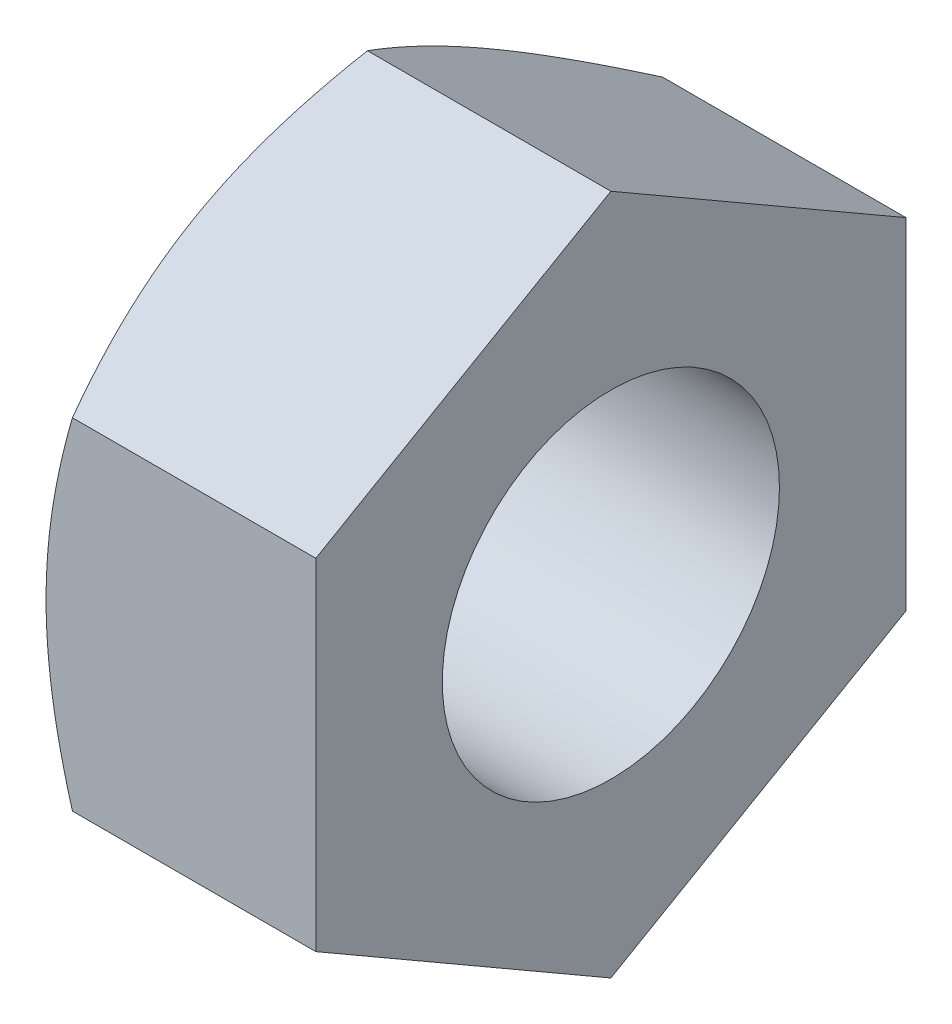
ISO-10303-21;
HEADER;
FILE_DESCRIPTION(('STEP AP214'),'2;1');
FILE_NAME('part.step','',(''),(''),'','','');
FILE_SCHEMA(('AUTOMOTIVE_DESIGN { 1 0 10303 214 1 1 1 1 }'));
ENDSEC;
DATA;
#1=APPLICATION_CONTEXT('core data for automotive mechanical design processes');
#2=APPLICATION_PROTOCOL_DEFINITION('international standard','automotive_design',2000,#1);
#3=PRODUCT_CONTEXT('',#1,'mechanical');
#4=PRODUCT('Part','Part','',(#3));
#5=PRODUCT_RELATED_PRODUCT_CATEGORY('part','',(#4));
#6=PRODUCT_DEFINITION_FORMATION('','',#4);
#7=PRODUCT_DEFINITION_CONTEXT('part definition',#1,'design');
#8=PRODUCT_DEFINITION('design','',#6,#7);
#9=PRODUCT_DEFINITION_SHAPE('','',#8);
#10=(LENGTH_UNIT() NAMED_UNIT(*) SI_UNIT(.MILLI.,.METRE.));
#11=(NAMED_UNIT(*) PLANE_ANGLE_UNIT() SI_UNIT($,.RADIAN.));
#12=(NAMED_UNIT(*) SI_UNIT($,.STERADIAN.) SOLID_ANGLE_UNIT());
#13=UNCERTAINTY_MEASURE_WITH_UNIT(LENGTH_MEASURE(1.E-05),#10,'distance_accuracy_value','');
#14=(GEOMETRIC_REPRESENTATION_CONTEXT(3) GLOBAL_UNCERTAINTY_ASSIGNED_CONTEXT((#13)) GLOBAL_UNIT_ASSIGNED_CONTEXT((#10,
#11,#12)) REPRESENTATION_CONTEXT('',''));
#15=CARTESIAN_POINT('',(0.,0.,0.));
#16=DIRECTION('',(0.,0.,1.));
#17=DIRECTION('',(1.,0.,0.));
#18=AXIS2_PLACEMENT_3D('',#15,#16,#17);
#19=CARTESIAN_POINT('',(-3.2,2.02072594216369,-3.5));
#20=DIRECTION('',(0.,0.866025403784438,-0.5));
#21=DIRECTION('',(0.,0.5,0.866025403784439));
#22=AXIS2_PLACEMENT_3D('',#19,#20,#21);
#23=PLANE('',#22);
#24=DIRECTION('',(1.,0.,0.));
#25=VECTOR('',#24,1.);
#26=CARTESIAN_POINT('',(-3.2,2.02072594216369,-3.5));
#27=LINE('',#26,#25);
#28=CARTESIAN_POINT('',(-2.88739260883036,2.0207259421637,-3.5));
#29=VERTEX_POINT('',#28);
#30=CARTESIAN_POINT('',(0.,2.02072594216369,-3.5));
#31=VERTEX_POINT('',#30);
#32=EDGE_CURVE('E149',#29,#31,#27,.T.);
#33=ORIENTED_EDGE('',*,*,#32,.F.);
#34=CARTESIAN_POINT('',(-2.88732593930663,2.02061047210986,-3.5002));
#35=CARTESIAN_POINT('',(-2.93861421101002,2.10941108799267,-3.34639282154755));
#36=CARTESIAN_POINT('',(-2.98525904618381,2.19897822522909,-3.19125798916558));
#37=CARTESIAN_POINT('',(-3.06667812446665,2.37966345361545,-2.87830199342322));
#38=CARTESIAN_POINT('',(-3.10142356441544,2.47078475532382,-2.7204752692125));
#39=CARTESIAN_POINT('',(-3.15550997281716,2.65189807961074,-2.40677778961987));
#40=CARTESIAN_POINT('',(-3.17521091373962,2.74186223545399,-2.25095530083931));
#41=CARTESIAN_POINT('',(-3.19872986726275,2.92221386641056,-1.93857711279463));
#42=CARTESIAN_POINT('',(-3.20256735545443,3.01260068598001,-1.78202254896577));
#43=CARTESIAN_POINT('',(-3.19458469812302,3.1814939814933,-1.48949078007901));
#44=CARTESIAN_POINT('',(-3.18472456593039,3.26002573814993,-1.3534697875421));
#45=CARTESIAN_POINT('',(-3.1534735331006,3.41657761679354,-1.08231397971101));
#46=CARTESIAN_POINT('',(-3.1320719567142,3.49459719728458,-0.947180102315318));
#47=CARTESIAN_POINT('',(-3.07856959211942,3.65147186489429,-0.675465207594817));
#48=CARTESIAN_POINT('',(-3.04624200555491,3.73030709667644,-0.538918580721665));
#49=CARTESIAN_POINT('',(-2.97287106619201,3.88680174018324,-0.267861907055499));
#50=CARTESIAN_POINT('',(-2.93184495343014,3.96446315689009,-0.133348387531463));
#51=CARTESIAN_POINT('',(-2.88732593930663,4.04156735438122,0.000199999999999847));
#52=B_SPLINE_CURVE_WITH_KNOTS('',3,(#34,#35,#36,#37,#38,#39,#40,#41,#42,#43,#44,#45,#46,#47,#48,
#49,#50,#51),.UNSPECIFIED.,.F.,.F.,(4,2,2,2,2,2,2,2,4),(0.,0.554793832886253,1.11092123814983,
1.65328467083218,2.19498204478403,2.6666513085086,3.13875761298267,3.62133612600509,
4.10296698719187),.UNSPECIFIED.);
#53=CARTESIAN_POINT('',(-3.2,3.03108891324554,-1.75));
#54=VERTEX_POINT('',#53);
#55=EDGE_CURVE('E133',#29,#54,#52,.T.);
#56=ORIENTED_EDGE('',*,*,#55,.T.);
#57=CARTESIAN_POINT('',(-2.88739260883036,4.04145188432738,0.));
#58=VERTEX_POINT('',#57);
#59=EDGE_CURVE('E62',#54,#58,#52,.T.);
#60=ORIENTED_EDGE('',*,*,#59,.T.);
#61=DIRECTION('',(1.,0.,0.));
#62=VECTOR('',#61,1.);
#63=CARTESIAN_POINT('',(-3.2,4.04145188432738,0.));
#64=LINE('',#63,#62);
#65=CARTESIAN_POINT('',(0.,4.04145188432738,0.));
#66=VERTEX_POINT('',#65);
#67=EDGE_CURVE('E128',#58,#66,#64,.T.);
#68=ORIENTED_EDGE('',*,*,#67,.T.);
#69=DIRECTION('',(0.,0.5,0.866025403784438));
#70=VECTOR('',#69,1.);
#71=CARTESIAN_POINT('',(0.,2.02072594216369,-3.5));
#72=LINE('',#71,#70);
#73=EDGE_CURVE('E163',#31,#66,#72,.T.);
#74=ORIENTED_EDGE('',*,*,#73,.F.);
#75=EDGE_LOOP('',(#33,#56,#60,#68,#74));
#76=FACE_BOUND('',#75,.T.);
#77=ADVANCED_FACE('F50',(#76),#23,.T.);
#78=CARTESIAN_POINT('',(-3.2,-2.02072594216369,-3.5));
#79=DIRECTION('',(0.,0.,-1.));
#80=DIRECTION('',(0.,1.,0.));
#81=AXIS2_PLACEMENT_3D('',#78,#79,#80);
#82=PLANE('',#81);
#83=DIRECTION('',(1.,0.,0.));
#84=VECTOR('',#83,1.);
#85=CARTESIAN_POINT('',(-3.2,-2.02072594216369,-3.5));
#86=LINE('',#85,#84);
#87=CARTESIAN_POINT('',(-2.88739260883036,-2.02072594216369,-3.50000000000001));
#88=VERTEX_POINT('',#87);
#89=CARTESIAN_POINT('',(0.,-2.02072594216369,-3.5));
#90=VERTEX_POINT('',#89);
#91=EDGE_CURVE('E147',#88,#90,#86,.T.);
#92=ORIENTED_EDGE('',*,*,#91,.F.);
#93=CARTESIAN_POINT('',(-1.52515592752212,-5.35926424048622,-3.5));
#94=CARTESIAN_POINT('',(-1.59941768502556,-5.20559440559575,-3.5));
#95=CARTESIAN_POINT('',(-1.67294121943884,-5.05156124454358,-3.5));
#96=CARTESIAN_POINT('',(-1.81808999583269,-4.74257181977882,-3.5));
#97=CARTESIAN_POINT('',(-1.88971490914505,-4.58761540185546,-3.5));
#98=CARTESIAN_POINT('',(-2.03102192117542,-4.27574595068724,-3.5));
#99=CARTESIAN_POINT('',(-2.10069055636515,-4.11882679505208,-3.5));
#100=CARTESIAN_POINT('',(-2.23703539071704,-3.80369874616064,-3.5));
#101=CARTESIAN_POINT('',(-2.30371174586118,-3.64548992064164,-3.5));
#102=CARTESIAN_POINT('',(-2.43406790909367,-3.32556686799683,-3.5));
#103=CARTESIAN_POINT('',(-2.49770087927351,-3.16383345099893,-3.5));
#104=CARTESIAN_POINT('',(-2.6199830990462,-2.83845895714228,-3.5));
#105=CARTESIAN_POINT('',(-2.67863179416419,-2.67481767033956,-3.5));
#106=CARTESIAN_POINT('',(-2.78936958912659,-2.34570319373403,-3.5));
#107=CARTESIAN_POINT('',(-2.84147263464488,-2.18023474470137,-3.5));
#108=CARTESIAN_POINT('',(-2.93742699169212,-1.84694549539021,-3.5));
#109=CARTESIAN_POINT('',(-2.98128091271442,-1.67912545711474,-3.5));
#110=CARTESIAN_POINT('',(-3.05860803602777,-1.34101838256746,-3.5));
#111=CARTESIAN_POINT('',(-3.09207847277522,-1.17073070168119,-3.5));
#112=CARTESIAN_POINT('',(-3.14638506285764,-0.828102254748875,-3.5));
#113=CARTESIAN_POINT('',(-3.16722120503054,-0.655761486889125,-3.5));
#114=CARTESIAN_POINT('',(-3.194415934084,-0.31102013069004,-3.5));
#115=CARTESIAN_POINT('',(-3.20086617529654,-0.138626960610222,-3.5));
#116=CARTESIAN_POINT('',(-3.19894642409482,0.206038662929256,-3.5));
#117=CARTESIAN_POINT('',(-3.19058027870772,0.378311136109275,-3.5));
#118=CARTESIAN_POINT('',(-3.16423102483762,0.672491314888646,-3.5));
#119=CARTESIAN_POINT('',(-3.14967926635671,0.794723571901816,-3.5));
#120=CARTESIAN_POINT('',(-3.11406313093411,1.03824387771237,-3.5));
#121=CARTESIAN_POINT('',(-3.09299772688288,1.15953177450312,-3.5));
#122=CARTESIAN_POINT('',(-3.02113660475034,1.52188005346716,-3.5));
#123=CARTESIAN_POINT('',(-2.96169447900539,1.76124198741877,-3.5));
#124=CARTESIAN_POINT('',(-2.85917288519019,2.11941071826359,-3.5));
#125=CARTESIAN_POINT('',(-2.82224998203008,2.24008446757475,-3.5));
#126=CARTESIAN_POINT('',(-2.74475063699412,2.48017245637078,-3.5));
#127=CARTESIAN_POINT('',(-2.70417671508573,2.59958750198738,-3.5));
#128=CARTESIAN_POINT('',(-2.62021960478085,2.83665872785761,-3.5));
#129=CARTESIAN_POINT('',(-2.57685351428723,2.95432102488643,-3.5));
#130=CARTESIAN_POINT('',(-2.48757598078988,3.1887327170062,-3.5));
#131=CARTESIAN_POINT('',(-2.4416635090405,3.30548172106717,-3.5));
#132=CARTESIAN_POINT('',(-2.39472912644301,3.4218085871934,-3.5));
#133=B_SPLINE_CURVE_WITH_KNOTS('',3,(#93,#94,#95,#96,#97,#98,#99,#100,#101,#102,#103,#104,#105,
#106,#107,#108,#109,#110,#111,#112,#113,#114,#115,#116,#117,#118,#119,#120,#121,#122,#123,#124,
#125,#126,#127,#128,#129,#130,#131,#132),.UNSPECIFIED.,.F.,.F.,(4,2,2,2,2,2,2,2,2,2,2,2,2,2,2,2,
2,2,2,4),(0.,0.512025467708519,1.02413900028468,1.53918315265711,2.05420042547922,
2.57554051253682,3.09693852027603,3.61720612610814,4.13730887487717,4.65755002944063,
5.17779164362335,5.69470915048345,6.21149246105175,6.58059842964299,6.94976263071818,
7.68864045992709,8.06719870082303,8.44549763256366,8.82166724342673,9.1979899509334),.UNSPECIFIED.);
#134=CARTESIAN_POINT('',(-3.2,0.,-3.5));
#135=VERTEX_POINT('',#134);
#136=EDGE_CURVE('E254',#88,#135,#133,.T.);
#137=ORIENTED_EDGE('',*,*,#136,.T.);
#138=EDGE_CURVE('E172',#135,#29,#133,.T.);
#139=ORIENTED_EDGE('',*,*,#138,.T.);
#140=ORIENTED_EDGE('',*,*,#32,.T.);
#141=DIRECTION('',(0.,1.,0.));
#142=VECTOR('',#141,1.);
#143=CARTESIAN_POINT('',(0.,-2.02072594216369,-3.5));
#144=LINE('',#143,#142);
#145=EDGE_CURVE('E140',#90,#31,#144,.T.);
#146=ORIENTED_EDGE('',*,*,#145,.F.);
#147=EDGE_LOOP('',(#92,#137,#139,#140,#146));
#148=FACE_BOUND('',#147,.T.);
#149=ADVANCED_FACE('F237',(#148),#82,.T.);
#150=CARTESIAN_POINT('',(-3.2,-4.04145188432738,0.));
#151=DIRECTION('',(0.,-0.866025403784439,-0.5));
#152=DIRECTION('',(0.,0.5,-0.866025403784439));
#153=AXIS2_PLACEMENT_3D('',#150,#151,#152);
#154=PLANE('',#153);
#155=DIRECTION('',(1.,0.,0.));
#156=VECTOR('',#155,1.);
#157=CARTESIAN_POINT('',(-3.2,-4.04145188432738,0.));
#158=LINE('',#157,#156);
#159=CARTESIAN_POINT('',(-2.88739260883036,-4.04145188432738,0.));
#160=VERTEX_POINT('',#159);
#161=CARTESIAN_POINT('',(0.,-4.04145188432738,0.));
#162=VERTEX_POINT('',#161);
#163=EDGE_CURVE('E146',#160,#162,#158,.T.);
#164=ORIENTED_EDGE('',*,*,#163,.F.);
#165=CARTESIAN_POINT('',(-2.88732593930663,-4.04156735438122,0.000200000000001309));
#166=CARTESIAN_POINT('',(-2.93861421101002,-3.9527667384984,-0.153607178452448));
#167=CARTESIAN_POINT('',(-2.98525904618381,-3.86319960126198,-0.308742010834422));
#168=CARTESIAN_POINT('',(-3.06667812446665,-3.68251437287562,-0.621698006576779));
#169=CARTESIAN_POINT('',(-3.10142356441544,-3.59139307116725,-0.779524730787493));
#170=CARTESIAN_POINT('',(-3.15550997281717,-3.41027974688034,-1.09322221038012));
#171=CARTESIAN_POINT('',(-3.17521091373962,-3.32031559103708,-1.24904469916069));
#172=CARTESIAN_POINT('',(-3.19872986726275,-3.13996396008052,-1.56142288720537));
#173=CARTESIAN_POINT('',(-3.20256735545444,-3.04957714051106,-1.71797745103423));
#174=CARTESIAN_POINT('',(-3.19458469812302,-2.88068384499777,-2.01050921992099));
#175=CARTESIAN_POINT('',(-3.1847245659304,-2.80215208834114,-2.1465302124579));
#176=CARTESIAN_POINT('',(-3.1534735331006,-2.64560020969753,-2.41768602028899));
#177=CARTESIAN_POINT('',(-3.1320719567142,-2.5675806292065,-2.55281989768468));
#178=CARTESIAN_POINT('',(-3.07856959211943,-2.41070596159678,-2.82453479240518));
#179=CARTESIAN_POINT('',(-3.04624200555492,-2.33187072981463,-2.96108141927833));
#180=CARTESIAN_POINT('',(-2.97287106619201,-2.17537608630783,-3.2321380929445));
#181=CARTESIAN_POINT('',(-2.93184495343014,-2.09771466960098,-3.36665161246854));
#182=CARTESIAN_POINT('',(-2.88732593930663,-2.02061047210985,-3.5002));
#183=B_SPLINE_CURVE_WITH_KNOTS('',3,(#165,#166,#167,#168,#169,#170,#171,#172,#173,#174,#175,
#176,#177,#178,#179,#180,#181,#182),.UNSPECIFIED.,.F.,.F.,(4,2,2,2,2,2,2,2,4),(0.,
0.554793832886252,1.11092123814983,1.65328467083218,2.19498204478403,2.66665130850859,
3.13875761298267,3.62133612600509,4.10296698719187),.UNSPECIFIED.);
#184=CARTESIAN_POINT('',(-3.2,-3.03108891324554,-1.75));
#185=VERTEX_POINT('',#184);
#186=EDGE_CURVE('E161',#160,#185,#183,.T.);
#187=ORIENTED_EDGE('',*,*,#186,.T.);
#188=EDGE_CURVE('E165',#185,#88,#183,.T.);
#189=ORIENTED_EDGE('',*,*,#188,.T.);
#190=ORIENTED_EDGE('',*,*,#91,.T.);
#191=DIRECTION('',(0.,0.5,-0.866025403784439));
#192=VECTOR('',#191,1.);
#193=CARTESIAN_POINT('',(0.,-4.04145188432738,0.));
#194=LINE('',#193,#192);
#195=EDGE_CURVE('E145',#162,#90,#194,.T.);
#196=ORIENTED_EDGE('',*,*,#195,.F.);
#197=EDGE_LOOP('',(#164,#187,#189,#190,#196));
#198=FACE_BOUND('',#197,.T.);
#199=ADVANCED_FACE('F181',(#198),#154,.T.);
#200=CARTESIAN_POINT('',(-3.2,-2.02072594216369,3.5));
#201=DIRECTION('',(0.,-0.866025403784438,0.5));
#202=DIRECTION('',(0.,-0.5,-0.866025403784439));
#203=AXIS2_PLACEMENT_3D('',#200,#201,#202);
#204=PLANE('',#203);
#205=DIRECTION('',(1.,0.,0.));
#206=VECTOR('',#205,1.);
#207=CARTESIAN_POINT('',(-3.2,-2.02072594216369,3.5));
#208=LINE('',#207,#206);
#209=CARTESIAN_POINT('',(-2.88739260883036,-2.0207259421637,3.5));
#210=VERTEX_POINT('',#209);
#211=CARTESIAN_POINT('',(0.,-2.02072594216369,3.5));
#212=VERTEX_POINT('',#211);
#213=EDGE_CURVE('E136',#210,#212,#208,.T.);
#214=ORIENTED_EDGE('',*,*,#213,.F.);
#215=CARTESIAN_POINT('',(-2.88732593930663,-2.02061047210985,3.5002));
#216=CARTESIAN_POINT('',(-2.93861421101002,-2.10941108799267,3.34639282154755));
#217=CARTESIAN_POINT('',(-2.98525904618381,-2.19897822522909,3.19125798916558));
#218=CARTESIAN_POINT('',(-3.06667812446665,-2.37966345361545,2.87830199342322));
#219=CARTESIAN_POINT('',(-3.10142356441544,-2.47078475532382,2.72047526921251));
#220=CARTESIAN_POINT('',(-3.15550997281717,-2.65189807961073,2.40677778961987));
#221=CARTESIAN_POINT('',(-3.17521091373962,-2.74186223545399,2.25095530083931));
#222=CARTESIAN_POINT('',(-3.19872986726275,-2.92221386641055,1.93857711279463));
#223=CARTESIAN_POINT('',(-3.20256735545444,-3.01260068598001,1.78202254896577));
#224=CARTESIAN_POINT('',(-3.19458469812302,-3.18149398149329,1.48949078007901));
#225=CARTESIAN_POINT('',(-3.1847245659304,-3.26002573814992,1.3534697875421));
#226=CARTESIAN_POINT('',(-3.1534735331006,-3.41657761679353,1.08231397971101));
#227=CARTESIAN_POINT('',(-3.1320719567142,-3.49459719728457,0.94718010231532));
#228=CARTESIAN_POINT('',(-3.07856959211943,-3.65147186489428,0.675465207594819));
#229=CARTESIAN_POINT('',(-3.04624200555492,-3.73030709667643,0.538918580721667));
#230=CARTESIAN_POINT('',(-2.97287106619201,-3.88680174018324,0.2678619070555));
#231=CARTESIAN_POINT('',(-2.93184495343014,-3.96446315689008,0.133348387531465));
#232=CARTESIAN_POINT('',(-2.88732593930663,-4.04156735438122,-0.000199999999998812));
#233=B_SPLINE_CURVE_WITH_KNOTS('',3,(#215,#216,#217,#218,#219,#220,#221,#222,#223,#224,#225,
#226,#227,#228,#229,#230,#231,#232),.UNSPECIFIED.,.F.,.F.,(4,2,2,2,2,2,2,2,4),(0.,
0.554793832886252,1.11092123814983,1.65328467083218,2.19498204478403,2.66665130850859,
3.13875761298267,3.62133612600509,4.10296698719187),.UNSPECIFIED.);
#234=CARTESIAN_POINT('',(-3.2,-3.03108891324554,1.75));
#235=VERTEX_POINT('',#234);
#236=EDGE_CURVE('E213',#210,#235,#233,.T.);
#237=ORIENTED_EDGE('',*,*,#236,.T.);
#238=EDGE_CURVE('E173',#235,#160,#233,.T.);
#239=ORIENTED_EDGE('',*,*,#238,.T.);
#240=ORIENTED_EDGE('',*,*,#163,.T.);
#241=DIRECTION('',(0.,-0.5,-0.866025403784438));
#242=VECTOR('',#241,1.);
#243=CARTESIAN_POINT('',(0.,-2.02072594216369,3.5));
#244=LINE('',#243,#242);
#245=EDGE_CURVE('E154',#212,#162,#244,.T.);
#246=ORIENTED_EDGE('',*,*,#245,.F.);
#247=EDGE_LOOP('',(#214,#237,#239,#240,#246));
#248=FACE_BOUND('',#247,.T.);
#249=ADVANCED_FACE('F223',(#248),#204,.T.);
#250=CARTESIAN_POINT('',(-3.2,2.02072594216369,3.5));
#251=DIRECTION('',(0.,0.,1.));
#252=DIRECTION('',(1.,0.,0.));
#253=AXIS2_PLACEMENT_3D('',#250,#251,#252);
#254=PLANE('',#253);
#255=DIRECTION('',(1.,0.,0.));
#256=VECTOR('',#255,1.);
#257=CARTESIAN_POINT('',(-3.2,2.02072594216369,3.5));
#258=LINE('',#257,#256);
#259=CARTESIAN_POINT('',(-2.88739260883036,2.02072594216369,3.5));
#260=VERTEX_POINT('',#259);
#261=CARTESIAN_POINT('',(0.,2.02072594216369,3.5));
#262=VERTEX_POINT('',#261);
#263=EDGE_CURVE('E139',#260,#262,#258,.T.);
#264=ORIENTED_EDGE('',*,*,#263,.F.);
#265=CARTESIAN_POINT('',(-1.52515653141447,-5.35926299121405,3.5));
#266=CARTESIAN_POINT('',(-1.59941826307899,-5.20559319908841,3.5));
#267=CARTESIAN_POINT('',(-1.67294177166855,-5.05156008083375,3.5));
#268=CARTESIAN_POINT('',(-1.81809049655251,-4.74257074180709,3.5));
#269=CARTESIAN_POINT('',(-1.8897153841787,-4.58761436682436,3.5));
#270=CARTESIAN_POINT('',(-2.03102234482378,-4.27574500225541,3.5));
#271=CARTESIAN_POINT('',(-2.10069095431986,-4.11882589028191,3.5));
#272=CARTESIAN_POINT('',(-2.23703573775726,-3.80369792903854,3.5));
#273=CARTESIAN_POINT('',(-2.3037120676805,-3.64548914750594,3.5));
#274=CARTESIAN_POINT('',(-2.43406818090495,-3.32556618401854,3.5));
#275=CARTESIAN_POINT('',(-2.49770112631115,-3.16383281219923,3.5));
#276=CARTESIAN_POINT('',(-2.61998329791052,-2.83845840945597,3.5));
#277=CARTESIAN_POINT('',(-2.67863196962932,-2.67481716858825,3.5));
#278=CARTESIAN_POINT('',(-2.78936972012299,-2.34570278472049,3.5));
#279=CARTESIAN_POINT('',(-2.84147274456415,-2.18023438248742,3.5));
#280=CARTESIAN_POINT('',(-2.93742706302356,-1.84694522806369,3.5));
#281=CARTESIAN_POINT('',(-2.98128096653285,-1.6791252378753,3.5));
#282=CARTESIAN_POINT('',(-3.05860805441522,-1.34101828610924,3.5));
#283=CARTESIAN_POINT('',(-3.09207847478803,-1.17073068027693,3.5));
#284=CARTESIAN_POINT('',(-3.14638504356795,-0.828102385138481,3.5));
#285=CARTESIAN_POINT('',(-3.16722118080476,-0.655761694017299,3.5));
#286=CARTESIAN_POINT('',(-3.19441591349424,-0.311020490924448,3.5));
#287=CARTESIAN_POINT('',(-3.20086616316591,-0.138627397207259,3.5));
#288=CARTESIAN_POINT('',(-3.19894644192205,0.206038074906535,3.5));
#289=CARTESIAN_POINT('',(-3.19058031803657,0.378310473023179,3.5));
#290=CARTESIAN_POINT('',(-3.16423110721311,0.672490555822329,3.5));
#291=CARTESIAN_POINT('',(-3.14967936596158,0.794722791084096,3.5));
#292=CARTESIAN_POINT('',(-3.11406326594664,1.03824305430561,3.5));
#293=CARTESIAN_POINT('',(-3.09299788007386,1.15953093025888,3.5));
#294=CARTESIAN_POINT('',(-3.02113681291855,1.5218791477135,3.5));
#295=CARTESIAN_POINT('',(-2.96169472437799,1.76124104212635,3.5));
#296=CARTESIAN_POINT('',(-2.85917318559744,2.11940971387712,3.5));
#297=CARTESIAN_POINT('',(-2.82225030091481,2.2400834431635,3.5));
#298=CARTESIAN_POINT('',(-2.7447509923007,2.48017139213732,3.5));
#299=CARTESIAN_POINT('',(-2.70417708833644,2.59958641795617,3.5));
#300=CARTESIAN_POINT('',(-2.62022001321724,2.83665760451803,3.5));
#301=CARTESIAN_POINT('',(-2.57685393996568,2.95431988203489,3.5));
#302=CARTESIAN_POINT('',(-2.48757644043312,3.18873153508805,3.5));
#303=CARTESIAN_POINT('',(-2.44166398540704,3.3054805195947,3.5));
#304=CARTESIAN_POINT('',(-2.39472961927592,3.42180736613355,3.5));
#305=B_SPLINE_CURVE_WITH_KNOTS('',3,(#265,#266,#267,#268,#269,#270,#271,#272,#273,#274,#275,
#276,#277,#278,#279,#280,#281,#282,#283,#284,#285,#286,#287,#288,#289,#290,#291,#292,#293,#294,
#295,#296,#297,#298,#299,#300,#301,#302,#303,#304),.UNSPECIFIED.,.F.,.F.,(4,2,2,2,2,2,2,2,2,2,2,
2,2,2,2,2,2,2,2,4),(0.,0.512025318465737,1.02413870177436,1.53918270315241,2.05419982499223,
2.57553975872798,3.09693761309352,3.617205066104,4.13730766217536,4.65754858684363,
5.1777899714696,5.6947072512228,6.21149033452399,6.5805962322233,6.94976036239485,
7.68863804939853,8.0671962166048,8.44549507476763,8.82166461280103,9.19798724733415),.UNSPECIFIED.);
#306=CARTESIAN_POINT('',(-3.2,0.,3.5));
#307=VERTEX_POINT('',#306);
#308=EDGE_CURVE('E124',#260,#307,#305,.F.);
#309=ORIENTED_EDGE('',*,*,#308,.T.);
#310=EDGE_CURVE('E217',#307,#210,#305,.F.);
#311=ORIENTED_EDGE('',*,*,#310,.T.);
#312=ORIENTED_EDGE('',*,*,#213,.T.);
#313=DIRECTION('',(0.,-1.,0.));
#314=VECTOR('',#313,1.);
#315=CARTESIAN_POINT('',(0.,2.02072594216369,3.5));
#316=LINE('',#315,#314);
#317=EDGE_CURVE('E160',#262,#212,#316,.T.);
#318=ORIENTED_EDGE('',*,*,#317,.F.);
#319=EDGE_LOOP('',(#264,#309,#311,#312,#318));
#320=FACE_BOUND('',#319,.T.);
#321=ADVANCED_FACE('F224',(#320),#254,.T.);
#322=CARTESIAN_POINT('',(-3.2,4.04145188432738,0.));
#323=DIRECTION('',(0.,0.866025403784439,0.5));
#324=DIRECTION('',(0.,-0.5,0.866025403784439));
#325=AXIS2_PLACEMENT_3D('',#322,#323,#324);
#326=PLANE('',#325);
#327=ORIENTED_EDGE('',*,*,#67,.F.);
#328=CARTESIAN_POINT('',(-2.88732593930663,4.04156735438122,-0.00020000000000041));
#329=CARTESIAN_POINT('',(-2.93861421101002,3.9527667384984,0.153607178452449));
#330=CARTESIAN_POINT('',(-2.9852590461838,3.86319960126198,0.308742010834424));
#331=CARTESIAN_POINT('',(-3.06667812446665,3.68251437287563,0.621698006576781));
#332=CARTESIAN_POINT('',(-3.10142356441544,3.59139307116725,0.779524730787495));
#333=CARTESIAN_POINT('',(-3.15550997281716,3.41027974688034,1.09322221038013));
#334=CARTESIAN_POINT('',(-3.17521091373962,3.32031559103708,1.24904469916069));
#335=CARTESIAN_POINT('',(-3.19872986726274,3.13996396008052,1.56142288720537));
#336=CARTESIAN_POINT('',(-3.20256735545443,3.04957714051106,1.71797745103423));
#337=CARTESIAN_POINT('',(-3.19458469812302,2.88068384499778,2.01050921992099));
#338=CARTESIAN_POINT('',(-3.18472456593039,2.80215208834115,2.14653021245791));
#339=CARTESIAN_POINT('',(-3.1534735331006,2.64560020969754,2.41768602028899));
#340=CARTESIAN_POINT('',(-3.1320719567142,2.5675806292065,2.55281989768468));
#341=CARTESIAN_POINT('',(-3.07856959211942,2.41070596159679,2.82453479240518));
#342=CARTESIAN_POINT('',(-3.04624200555491,2.33187072981464,2.96108141927834));
#343=CARTESIAN_POINT('',(-2.97287106619201,2.17537608630783,3.2321380929445));
#344=CARTESIAN_POINT('',(-2.93184495343014,2.09771466960099,3.36665161246854));
#345=CARTESIAN_POINT('',(-2.88732593930663,2.02061047210986,3.5002));
#346=B_SPLINE_CURVE_WITH_KNOTS('',3,(#328,#329,#330,#331,#332,#333,#334,#335,#336,#337,#338,
#339,#340,#341,#342,#343,#344,#345),.UNSPECIFIED.,.F.,.F.,(4,2,2,2,2,2,2,2,4),(0.,
0.554793832886253,1.11092123814983,1.65328467083218,2.19498204478403,2.6666513085086,
3.13875761298267,3.62133612600509,4.10296698719187),.UNSPECIFIED.);
#347=CARTESIAN_POINT('',(-3.2,3.03108891324554,1.75));
#348=VERTEX_POINT('',#347);
#349=EDGE_CURVE('E120',#58,#348,#346,.T.);
#350=ORIENTED_EDGE('',*,*,#349,.T.);
#351=EDGE_CURVE('E67',#348,#260,#346,.T.);
#352=ORIENTED_EDGE('',*,*,#351,.T.);
#353=ORIENTED_EDGE('',*,*,#263,.T.);
#354=DIRECTION('',(0.,-0.5,0.866025403784439));
#355=VECTOR('',#354,1.);
#356=CARTESIAN_POINT('',(0.,4.04145188432738,0.));
#357=LINE('',#356,#355);
#358=EDGE_CURVE('E132',#66,#262,#357,.T.);
#359=ORIENTED_EDGE('',*,*,#358,.F.);
#360=EDGE_LOOP('',(#327,#350,#352,#353,#359));
#361=FACE_BOUND('',#360,.T.);
#362=ADVANCED_FACE('F131',(#361),#326,.T.);
#363=CARTESIAN_POINT('',(0.,0.,0.));
#364=DIRECTION('',(1.,0.,0.));
#365=DIRECTION('',(0.,0.,-1.));
#366=AXIS2_PLACEMENT_3D('',#363,#364,#365);
#367=PLANE('',#366);
#368=CARTESIAN_POINT('',(0.,0.,0.));
#369=DIRECTION('',(1.,0.,0.));
#370=DIRECTION('',(0.,0.,-1.));
#371=AXIS2_PLACEMENT_3D('',#368,#369,#370);
#372=CIRCLE('',#371,2.);
#373=CARTESIAN_POINT('',(0.,0.,-2.));
#374=VERTEX_POINT('',#373);
#375=EDGE_CURVE('E285',#374,#374,#372,.T.);
#376=ORIENTED_EDGE('',*,*,#375,.F.);
#377=EDGE_LOOP('',(#376));
#378=FACE_BOUND('',#377,.T.);
#379=ORIENTED_EDGE('',*,*,#73,.T.);
#380=ORIENTED_EDGE('',*,*,#358,.T.);
#381=ORIENTED_EDGE('',*,*,#317,.T.);
#382=ORIENTED_EDGE('',*,*,#245,.T.);
#383=ORIENTED_EDGE('',*,*,#195,.T.);
#384=ORIENTED_EDGE('',*,*,#145,.T.);
#385=EDGE_LOOP('',(#379,#380,#381,#382,#383,#384));
#386=FACE_BOUND('',#385,.T.);
#387=ADVANCED_FACE('F233',(#378,#386),#367,.T.);
#388=CARTESIAN_POINT('',(-3.2,0.,0.));
#389=DIRECTION('',(1.,0.,0.));
#390=DIRECTION('',(0.,0.,-1.));
#391=AXIS2_PLACEMENT_3D('',#388,#389,#390);
#392=CONICAL_SURFACE('',#391,3.5,1.0471975511966);
#393=CARTESIAN_POINT('',(-3.2,0.,0.));
#394=DIRECTION('',(1.,0.,0.));
#395=DIRECTION('',(0.,0.,-1.));
#396=AXIS2_PLACEMENT_3D('',#393,#394,#395);
#397=CIRCLE('',#396,3.5);
#398=EDGE_CURVE('E51',#185,#135,#397,.T.);
#399=ORIENTED_EDGE('',*,*,#398,.T.);
#400=ORIENTED_EDGE('',*,*,#136,.F.);
#401=ORIENTED_EDGE('',*,*,#188,.F.);
#402=EDGE_LOOP('',(#399,#400,#401));
#403=FACE_BOUND('',#402,.T.);
#404=ADVANCED_FACE('F236',(#403),#392,.T.);
#405=ORIENTED_EDGE('',*,*,#238,.F.);
#406=EDGE_CURVE('E267',#235,#185,#397,.T.);
#407=ORIENTED_EDGE('',*,*,#406,.T.);
#408=ORIENTED_EDGE('',*,*,#186,.F.);
#409=EDGE_LOOP('',(#405,#407,#408));
#410=FACE_BOUND('',#409,.T.);
#411=ADVANCED_FACE('F188',(#410),#392,.T.);
#412=ORIENTED_EDGE('',*,*,#310,.F.);
#413=EDGE_CURVE('E268',#307,#235,#397,.T.);
#414=ORIENTED_EDGE('',*,*,#413,.T.);
#415=ORIENTED_EDGE('',*,*,#236,.F.);
#416=EDGE_LOOP('',(#412,#414,#415));
#417=FACE_BOUND('',#416,.T.);
#418=ADVANCED_FACE('F186',(#417),#392,.T.);
#419=ORIENTED_EDGE('',*,*,#351,.F.);
#420=CARTESIAN_POINT('',(-3.2,0.,0.));
#421=DIRECTION('',(-1.,0.,0.));
#422=DIRECTION('',(0.,0.,1.));
#423=AXIS2_PLACEMENT_3D('',#420,#421,#422);
#424=CIRCLE('',#423,3.5);
#425=EDGE_CURVE('E278',#307,#348,#424,.T.);
#426=ORIENTED_EDGE('',*,*,#425,.F.);
#427=ORIENTED_EDGE('',*,*,#308,.F.);
#428=EDGE_LOOP('',(#419,#426,#427));
#429=FACE_BOUND('',#428,.T.);
#430=ADVANCED_FACE('F183',(#429),#392,.T.);
#431=EDGE_CURVE('E57',#54,#348,#397,.T.);
#432=ORIENTED_EDGE('',*,*,#431,.T.);
#433=ORIENTED_EDGE('',*,*,#349,.F.);
#434=ORIENTED_EDGE('',*,*,#59,.F.);
#435=EDGE_LOOP('',(#432,#433,#434));
#436=FACE_BOUND('',#435,.T.);
#437=ADVANCED_FACE('F117',(#436),#392,.T.);
#438=EDGE_CURVE('E11',#135,#54,#397,.T.);
#439=ORIENTED_EDGE('',*,*,#438,.T.);
#440=ORIENTED_EDGE('',*,*,#55,.F.);
#441=ORIENTED_EDGE('',*,*,#138,.F.);
#442=EDGE_LOOP('',(#439,#440,#441));
#443=FACE_BOUND('',#442,.T.);
#444=ADVANCED_FACE('F273',(#443),#392,.T.);
#445=CARTESIAN_POINT('',(-3.2,0.,0.));
#446=DIRECTION('',(1.,0.,0.));
#447=DIRECTION('',(0.,0.,-1.));
#448=AXIS2_PLACEMENT_3D('',#445,#446,#447);
#449=PLANE('',#448);
#450=CARTESIAN_POINT('',(-3.2,0.,0.));
#451=DIRECTION('',(1.,0.,0.));
#452=DIRECTION('',(0.,0.,-1.));
#453=AXIS2_PLACEMENT_3D('',#450,#451,#452);
#454=CIRCLE('',#453,2.);
#455=CARTESIAN_POINT('',(-3.2,0.,-2.));
#456=VERTEX_POINT('',#455);
#457=EDGE_CURVE('E279',#456,#456,#454,.T.);
#458=ORIENTED_EDGE('',*,*,#457,.T.);
#459=EDGE_LOOP('',(#458));
#460=FACE_BOUND('',#459,.T.);
#461=ORIENTED_EDGE('',*,*,#438,.F.);
#462=ORIENTED_EDGE('',*,*,#398,.F.);
#463=ORIENTED_EDGE('',*,*,#406,.F.);
#464=ORIENTED_EDGE('',*,*,#413,.F.);
#465=ORIENTED_EDGE('',*,*,#425,.T.);
#466=ORIENTED_EDGE('',*,*,#431,.F.);
#467=EDGE_LOOP('',(#461,#462,#463,#464,#465,#466));
#468=FACE_BOUND('',#467,.T.);
#469=ADVANCED_FACE('F195',(#460,#468),#449,.F.);
#470=CARTESIAN_POINT('',(-3.2,0.,0.));
#471=DIRECTION('',(1.,0.,0.));
#472=DIRECTION('',(0.,0.,-1.));
#473=AXIS2_PLACEMENT_3D('',#470,#471,#472);
#474=CYLINDRICAL_SURFACE('',#473,2.);
#475=ORIENTED_EDGE('',*,*,#457,.F.);
#476=EDGE_LOOP('',(#475));
#477=FACE_BOUND('',#476,.T.);
#478=ORIENTED_EDGE('',*,*,#375,.T.);
#479=EDGE_LOOP('',(#478));
#480=FACE_BOUND('',#479,.T.);
#481=ADVANCED_FACE('F191',(#477,#480),#474,.F.);
#482=CLOSED_SHELL('',(#77,#149,#199,#249,#321,#362,#387,#404,#411,#418,#430,#437,#444,#469,#481));
#483=MANIFOLD_SOLID_BREP('B2',#482);
#484=ADVANCED_BREP_SHAPE_REPRESENTATION('',(#18,#483),#14);
#485=SHAPE_DEFINITION_REPRESENTATION(#9,#484);
ENDSEC;
END-ISO-10303-21;
